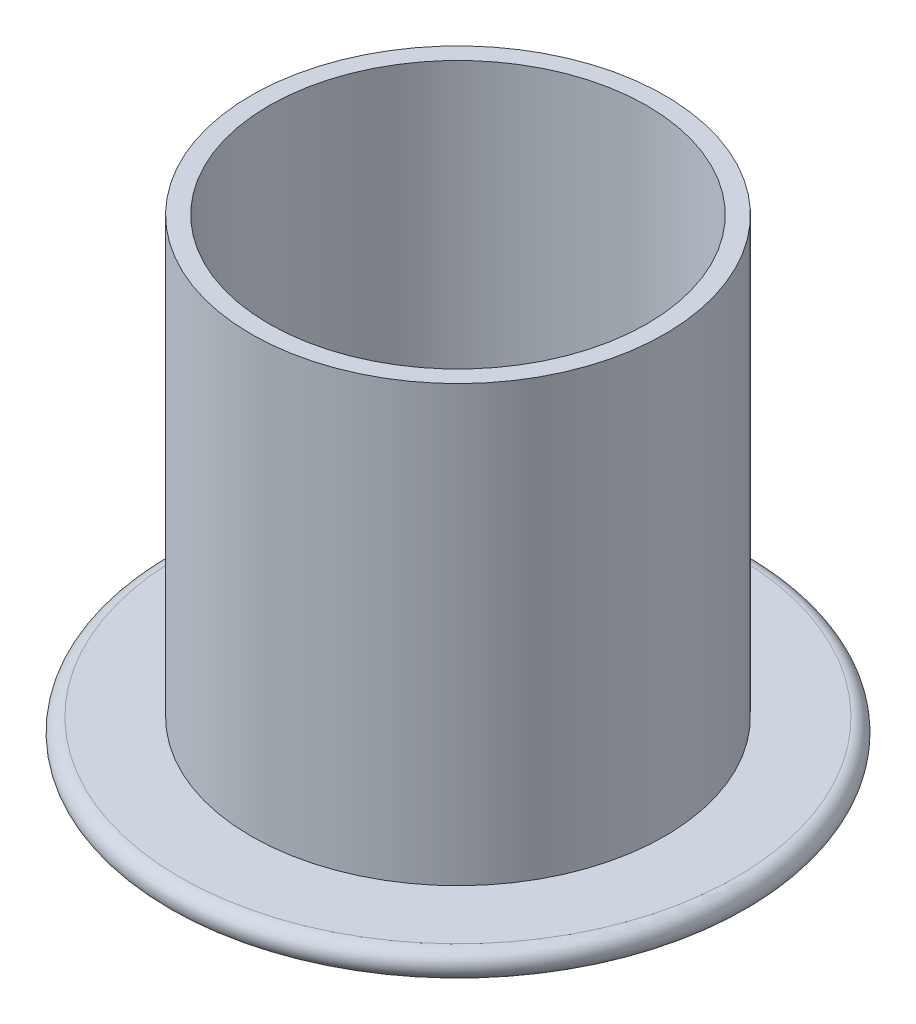
ISO-10303-21;
HEADER;
FILE_DESCRIPTION(('STEP AP214'),'2;1');
FILE_NAME('part.step','',(''),(''),'','','');
FILE_SCHEMA(('AUTOMOTIVE_DESIGN { 1 0 10303 214 1 1 1 1 }'));
ENDSEC;
DATA;
#1=APPLICATION_CONTEXT('core data for automotive mechanical design processes');
#2=APPLICATION_PROTOCOL_DEFINITION('international standard','automotive_design',2000,#1);
#3=PRODUCT_CONTEXT('',#1,'mechanical');
#4=PRODUCT('Part','Part','',(#3));
#5=PRODUCT_RELATED_PRODUCT_CATEGORY('part','',(#4));
#6=PRODUCT_DEFINITION_FORMATION('','',#4);
#7=PRODUCT_DEFINITION_CONTEXT('part definition',#1,'design');
#8=PRODUCT_DEFINITION('design','',#6,#7);
#9=PRODUCT_DEFINITION_SHAPE('','',#8);
#10=(LENGTH_UNIT() NAMED_UNIT(*) SI_UNIT(.MILLI.,.METRE.));
#11=(NAMED_UNIT(*) PLANE_ANGLE_UNIT() SI_UNIT($,.RADIAN.));
#12=(NAMED_UNIT(*) SI_UNIT($,.STERADIAN.) SOLID_ANGLE_UNIT());
#13=UNCERTAINTY_MEASURE_WITH_UNIT(LENGTH_MEASURE(1.E-05),#10,'distance_accuracy_value','');
#14=(GEOMETRIC_REPRESENTATION_CONTEXT(3) GLOBAL_UNCERTAINTY_ASSIGNED_CONTEXT((#13)) GLOBAL_UNIT_ASSIGNED_CONTEXT((#10,
#11,#12)) REPRESENTATION_CONTEXT('',''));
#15=CARTESIAN_POINT('',(0.,0.,0.));
#16=DIRECTION('',(0.,0.,1.));
#17=DIRECTION('',(1.,0.,0.));
#18=AXIS2_PLACEMENT_3D('',#15,#16,#17);
#19=CARTESIAN_POINT('',(0.,-20.2055016292455,0.));
#20=DIRECTION('',(0.,1.,0.));
#21=DIRECTION('',(0.,0.,1.));
#22=AXIS2_PLACEMENT_3D('',#19,#20,#21);
#23=TOROIDAL_SURFACE('',#22,31.25,1.5);
#24=CARTESIAN_POINT('',(0.,-18.7055016292455,0.));
#25=DIRECTION('',(0.,1.,0.));
#26=DIRECTION('',(0.,0.,1.));
#27=AXIS2_PLACEMENT_3D('',#24,#25,#26);
#28=CIRCLE('',#27,31.25);
#29=CARTESIAN_POINT('',(0.,-18.7055016292455,31.25));
#30=VERTEX_POINT('',#29);
#31=EDGE_CURVE('E62',#30,#30,#28,.T.);
#32=ORIENTED_EDGE('',*,*,#31,.F.);
#33=EDGE_LOOP('',(#32));
#34=FACE_BOUND('',#33,.T.);
#35=CARTESIAN_POINT('',(0.,-21.6420135067079,0.));
#36=DIRECTION('',(0.,1.,0.));
#37=DIRECTION('',(0.,0.,1.));
#38=AXIS2_PLACEMENT_3D('',#35,#36,#37);
#39=CIRCLE('',#38,31.6817796033968);
#40=CARTESIAN_POINT('',(0.,-21.6420135067079,31.6817796033968));
#41=VERTEX_POINT('',#40);
#42=EDGE_CURVE('E10',#41,#41,#39,.T.);
#43=ORIENTED_EDGE('',*,*,#42,.T.);
#44=EDGE_LOOP('',(#43));
#45=FACE_BOUND('',#44,.T.);
#46=ADVANCED_FACE('F34',(#34,#45),#23,.T.);
#47=CARTESIAN_POINT('',(0.,-23.5752458661897,0.));
#48=DIRECTION('',(0.,1.,0.));
#49=DIRECTION('',(0.,0.,1.));
#50=AXIS2_PLACEMENT_3D('',#47,#48,#49);
#51=CONICAL_SURFACE('',#50,25.25,1.27881206364187);
#52=ORIENTED_EDGE('',*,*,#42,.F.);
#53=EDGE_LOOP('',(#52));
#54=FACE_BOUND('',#53,.T.);
#55=CARTESIAN_POINT('',(0.,-23.5752458661897,0.));
#56=DIRECTION('',(0.,1.,0.));
#57=DIRECTION('',(0.,0.,1.));
#58=AXIS2_PLACEMENT_3D('',#55,#56,#57);
#59=CIRCLE('',#58,25.25);
#60=CARTESIAN_POINT('',(0.,-23.5752458661897,25.25));
#61=VERTEX_POINT('',#60);
#62=EDGE_CURVE('E40',#61,#61,#59,.T.);
#63=ORIENTED_EDGE('',*,*,#62,.T.);
#64=EDGE_LOOP('',(#63));
#65=FACE_BOUND('',#64,.T.);
#66=ADVANCED_FACE('F69',(#54,#65),#51,.T.);
#67=CARTESIAN_POINT('',(0.,43.6021834258593,0.));
#68=DIRECTION('',(0.,1.,0.));
#69=DIRECTION('',(0.,0.,1.));
#70=AXIS2_PLACEMENT_3D('',#67,#68,#69);
#71=CYLINDRICAL_SURFACE('',#70,25.25);
#72=ORIENTED_EDGE('',*,*,#62,.F.);
#73=EDGE_LOOP('',(#72));
#74=FACE_BOUND('',#73,.T.);
#75=CARTESIAN_POINT('',(0.,-25.5752458661897,0.));
#76=DIRECTION('',(0.,1.,0.));
#77=DIRECTION('',(0.,0.,1.));
#78=AXIS2_PLACEMENT_3D('',#75,#76,#77);
#79=CIRCLE('',#78,25.25);
#80=CARTESIAN_POINT('',(0.,-25.5752458661897,25.25));
#81=VERTEX_POINT('',#80);
#82=EDGE_CURVE('E44',#81,#81,#79,.T.);
#83=ORIENTED_EDGE('',*,*,#82,.T.);
#84=EDGE_LOOP('',(#83));
#85=FACE_BOUND('',#84,.T.);
#86=ADVANCED_FACE('F73',(#74,#85),#71,.T.);
#87=CARTESIAN_POINT('',(25.25,-25.5752458661897,0.));
#88=DIRECTION('',(0.,1.,0.));
#89=DIRECTION('',(0.,0.,1.));
#90=AXIS2_PLACEMENT_3D('',#87,#88,#89);
#91=PLANE('',#90);
#92=ORIENTED_EDGE('',*,*,#82,.F.);
#93=EDGE_LOOP('',(#92));
#94=FACE_BOUND('',#93,.T.);
#95=CARTESIAN_POINT('',(0.,-25.5752458661897,0.));
#96=DIRECTION('',(0.,1.,0.));
#97=DIRECTION('',(0.,0.,1.));
#98=AXIS2_PLACEMENT_3D('',#95,#96,#97);
#99=CIRCLE('',#98,21.25);
#100=CARTESIAN_POINT('',(0.,-25.5752458661897,21.25));
#101=VERTEX_POINT('',#100);
#102=EDGE_CURVE('E48',#101,#101,#99,.T.);
#103=ORIENTED_EDGE('',*,*,#102,.T.);
#104=EDGE_LOOP('',(#103));
#105=FACE_BOUND('',#104,.T.);
#106=ADVANCED_FACE('F78',(#94,#105),#91,.F.);
#107=CARTESIAN_POINT('',(0.,43.6021834258593,0.));
#108=DIRECTION('',(0.,1.,0.));
#109=DIRECTION('',(0.,0.,1.));
#110=AXIS2_PLACEMENT_3D('',#107,#108,#109);
#111=CYLINDRICAL_SURFACE('',#110,21.25);
#112=ORIENTED_EDGE('',*,*,#102,.F.);
#113=EDGE_LOOP('',(#112));
#114=FACE_BOUND('',#113,.T.);
#115=CARTESIAN_POINT('',(0.,30.1861269871334,0.));
#116=DIRECTION('',(0.,1.,0.));
#117=DIRECTION('',(0.,0.,1.));
#118=AXIS2_PLACEMENT_3D('',#115,#116,#117);
#119=CIRCLE('',#118,21.25);
#120=CARTESIAN_POINT('',(0.,30.1861269871334,21.25));
#121=VERTEX_POINT('',#120);
#122=EDGE_CURVE('E53',#121,#121,#119,.T.);
#123=ORIENTED_EDGE('',*,*,#122,.T.);
#124=EDGE_LOOP('',(#123));
#125=FACE_BOUND('',#124,.T.);
#126=ADVANCED_FACE('F84',(#114,#125),#111,.F.);
#127=CARTESIAN_POINT('',(21.25,30.1861269871334,0.));
#128=DIRECTION('',(0.,-1.,0.));
#129=DIRECTION('',(0.,0.,-1.));
#130=AXIS2_PLACEMENT_3D('',#127,#128,#129);
#131=PLANE('',#130);
#132=ORIENTED_EDGE('',*,*,#122,.F.);
#133=EDGE_LOOP('',(#132));
#134=FACE_BOUND('',#133,.T.);
#135=CARTESIAN_POINT('',(0.,30.1861269871334,0.));
#136=DIRECTION('',(0.,1.,0.));
#137=DIRECTION('',(0.,0.,1.));
#138=AXIS2_PLACEMENT_3D('',#135,#136,#137);
#139=CIRCLE('',#138,23.25);
#140=CARTESIAN_POINT('',(0.,30.1861269871334,23.25));
#141=VERTEX_POINT('',#140);
#142=EDGE_CURVE('E56',#141,#141,#139,.T.);
#143=ORIENTED_EDGE('',*,*,#142,.T.);
#144=EDGE_LOOP('',(#143));
#145=FACE_BOUND('',#144,.T.);
#146=ADVANCED_FACE('F88',(#134,#145),#131,.F.);
#147=CARTESIAN_POINT('',(0.,43.6021834258593,0.));
#148=DIRECTION('',(0.,1.,0.));
#149=DIRECTION('',(0.,0.,1.));
#150=AXIS2_PLACEMENT_3D('',#147,#148,#149);
#151=CYLINDRICAL_SURFACE('',#150,23.25);
#152=ORIENTED_EDGE('',*,*,#142,.F.);
#153=EDGE_LOOP('',(#152));
#154=FACE_BOUND('',#153,.T.);
#155=CARTESIAN_POINT('',(0.,-18.7055016292455,0.));
#156=DIRECTION('',(0.,1.,0.));
#157=DIRECTION('',(0.,0.,1.));
#158=AXIS2_PLACEMENT_3D('',#155,#156,#157);
#159=CIRCLE('',#158,23.25);
#160=CARTESIAN_POINT('',(0.,-18.7055016292455,23.25));
#161=VERTEX_POINT('',#160);
#162=EDGE_CURVE('E59',#161,#161,#159,.T.);
#163=ORIENTED_EDGE('',*,*,#162,.T.);
#164=EDGE_LOOP('',(#163));
#165=FACE_BOUND('',#164,.T.);
#166=ADVANCED_FACE('F92',(#154,#165),#151,.T.);
#167=CARTESIAN_POINT('',(23.25,-18.7055016292455,0.));
#168=DIRECTION('',(0.,-1.,0.));
#169=DIRECTION('',(0.,0.,-1.));
#170=AXIS2_PLACEMENT_3D('',#167,#168,#169);
#171=PLANE('',#170);
#172=ORIENTED_EDGE('',*,*,#162,.F.);
#173=EDGE_LOOP('',(#172));
#174=FACE_BOUND('',#173,.T.);
#175=ORIENTED_EDGE('',*,*,#31,.T.);
#176=EDGE_LOOP('',(#175));
#177=FACE_BOUND('',#176,.T.);
#178=ADVANCED_FACE('F66',(#174,#177),#171,.F.);
#179=CLOSED_SHELL('',(#46,#66,#86,#106,#126,#146,#166,#178));
#180=MANIFOLD_SOLID_BREP('B2',#179);
#181=ADVANCED_BREP_SHAPE_REPRESENTATION('',(#18,#180),#14);
#182=SHAPE_DEFINITION_REPRESENTATION(#9,#181);
ENDSEC;
END-ISO-10303-21;
